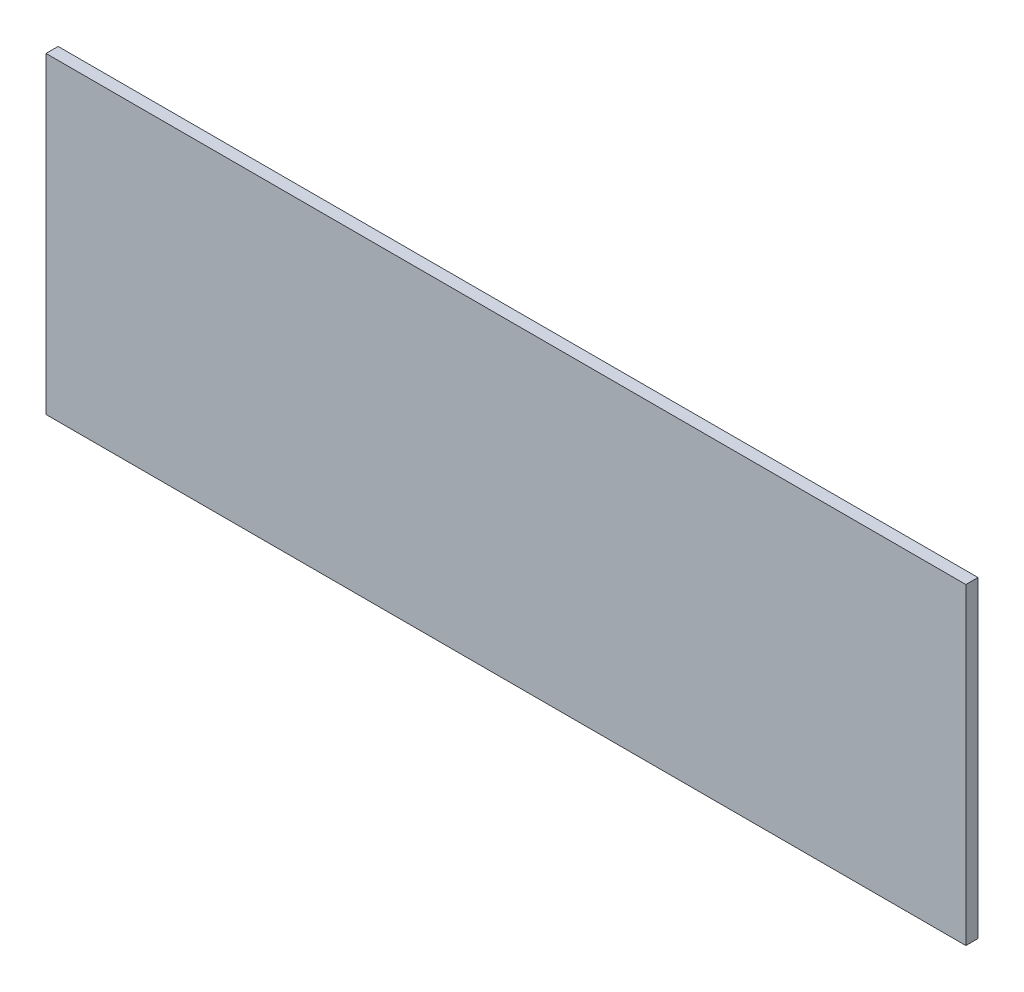
ISO-10303-21;
HEADER;
FILE_DESCRIPTION(('STEP AP214'),'2;1');
FILE_NAME('part.step','',(''),(''),'','','');
FILE_SCHEMA(('AUTOMOTIVE_DESIGN { 1 0 10303 214 1 1 1 1 }'));
ENDSEC;
DATA;
#1=APPLICATION_CONTEXT('core data for automotive mechanical design processes');
#2=APPLICATION_PROTOCOL_DEFINITION('international standard','automotive_design',2000,#1);
#3=PRODUCT_CONTEXT('',#1,'mechanical');
#4=PRODUCT('Part','Part','',(#3));
#5=PRODUCT_RELATED_PRODUCT_CATEGORY('part','',(#4));
#6=PRODUCT_DEFINITION_FORMATION('','',#4);
#7=PRODUCT_DEFINITION_CONTEXT('part definition',#1,'design');
#8=PRODUCT_DEFINITION('design','',#6,#7);
#9=PRODUCT_DEFINITION_SHAPE('','',#8);
#10=(LENGTH_UNIT() NAMED_UNIT(*) SI_UNIT(.MILLI.,.METRE.));
#11=(NAMED_UNIT(*) PLANE_ANGLE_UNIT() SI_UNIT($,.RADIAN.));
#12=(NAMED_UNIT(*) SI_UNIT($,.STERADIAN.) SOLID_ANGLE_UNIT());
#13=UNCERTAINTY_MEASURE_WITH_UNIT(LENGTH_MEASURE(1.E-05),#10,'distance_accuracy_value','');
#14=(GEOMETRIC_REPRESENTATION_CONTEXT(3) GLOBAL_UNCERTAINTY_ASSIGNED_CONTEXT((#13)) GLOBAL_UNIT_ASSIGNED_CONTEXT((#10,
#11,#12)) REPRESENTATION_CONTEXT('',''));
#15=CARTESIAN_POINT('',(0.,0.,0.));
#16=DIRECTION('',(0.,0.,1.));
#17=DIRECTION('',(1.,0.,0.));
#18=AXIS2_PLACEMENT_3D('',#15,#16,#17);
#19=CARTESIAN_POINT('',(151.5,-51.5,4.));
#20=DIRECTION('',(-1.,0.,0.));
#21=DIRECTION('',(0.,0.,1.));
#22=AXIS2_PLACEMENT_3D('',#19,#20,#21);
#23=PLANE('',#22);
#24=DIRECTION('',(0.,1.,0.));
#25=VECTOR('',#24,1.);
#26=CARTESIAN_POINT('',(151.5,-51.5,0.));
#27=LINE('',#26,#25);
#28=CARTESIAN_POINT('',(151.5,-51.5,0.));
#29=VERTEX_POINT('',#28);
#30=CARTESIAN_POINT('',(151.5,51.5,0.));
#31=VERTEX_POINT('',#30);
#32=EDGE_CURVE('E116',#29,#31,#27,.T.);
#33=ORIENTED_EDGE('',*,*,#32,.T.);
#34=DIRECTION('',(0.,0.,-1.));
#35=VECTOR('',#34,1.);
#36=CARTESIAN_POINT('',(151.5,51.5,4.));
#37=LINE('',#36,#35);
#38=CARTESIAN_POINT('',(151.5,51.5,4.));
#39=VERTEX_POINT('',#38);
#40=EDGE_CURVE('E11',#39,#31,#37,.T.);
#41=ORIENTED_EDGE('',*,*,#40,.F.);
#42=DIRECTION('',(0.,1.,0.));
#43=VECTOR('',#42,1.);
#44=CARTESIAN_POINT('',(151.5,-51.5,4.));
#45=LINE('',#44,#43);
#46=CARTESIAN_POINT('',(151.5,-51.5,4.));
#47=VERTEX_POINT('',#46);
#48=EDGE_CURVE('E99',#47,#39,#45,.T.);
#49=ORIENTED_EDGE('',*,*,#48,.F.);
#50=DIRECTION('',(0.,0.,-1.));
#51=VECTOR('',#50,1.);
#52=CARTESIAN_POINT('',(151.5,-51.5,4.));
#53=LINE('',#52,#51);
#54=EDGE_CURVE('E112',#47,#29,#53,.T.);
#55=ORIENTED_EDGE('',*,*,#54,.T.);
#56=EDGE_LOOP('',(#33,#41,#49,#55));
#57=FACE_BOUND('',#56,.T.);
#58=ADVANCED_FACE('F47',(#57),#23,.F.);
#59=CARTESIAN_POINT('',(-151.5,51.5,4.));
#60=DIRECTION('',(0.,-1.,0.));
#61=DIRECTION('',(0.,0.,-1.));
#62=AXIS2_PLACEMENT_3D('',#59,#60,#61);
#63=PLANE('',#62);
#64=DIRECTION('',(-1.,0.,0.));
#65=VECTOR('',#64,1.);
#66=CARTESIAN_POINT('',(-151.5,51.5,0.));
#67=LINE('',#66,#65);
#68=CARTESIAN_POINT('',(-151.5,51.5,0.));
#69=VERTEX_POINT('',#68);
#70=EDGE_CURVE('E104',#31,#69,#67,.T.);
#71=ORIENTED_EDGE('',*,*,#70,.T.);
#72=DIRECTION('',(0.,0.,-1.));
#73=VECTOR('',#72,1.);
#74=CARTESIAN_POINT('',(-151.5,51.5,4.));
#75=LINE('',#74,#73);
#76=CARTESIAN_POINT('',(-151.5,51.5,4.));
#77=VERTEX_POINT('',#76);
#78=EDGE_CURVE('E56',#77,#69,#75,.T.);
#79=ORIENTED_EDGE('',*,*,#78,.F.);
#80=DIRECTION('',(-1.,0.,0.));
#81=VECTOR('',#80,1.);
#82=CARTESIAN_POINT('',(-151.5,51.5,4.));
#83=LINE('',#82,#81);
#84=EDGE_CURVE('E94',#39,#77,#83,.T.);
#85=ORIENTED_EDGE('',*,*,#84,.F.);
#86=ORIENTED_EDGE('',*,*,#40,.T.);
#87=EDGE_LOOP('',(#71,#79,#85,#86));
#88=FACE_BOUND('',#87,.T.);
#89=ADVANCED_FACE('F103',(#88),#63,.F.);
#90=CARTESIAN_POINT('',(-151.5,-51.5,4.));
#91=DIRECTION('',(1.,0.,0.));
#92=DIRECTION('',(0.,0.,-1.));
#93=AXIS2_PLACEMENT_3D('',#90,#91,#92);
#94=PLANE('',#93);
#95=DIRECTION('',(0.,-1.,0.));
#96=VECTOR('',#95,1.);
#97=CARTESIAN_POINT('',(-151.5,-51.5,0.));
#98=LINE('',#97,#96);
#99=CARTESIAN_POINT('',(-151.5,-51.5,0.));
#100=VERTEX_POINT('',#99);
#101=EDGE_CURVE('E81',#69,#100,#98,.T.);
#102=ORIENTED_EDGE('',*,*,#101,.T.);
#103=DIRECTION('',(0.,0.,-1.));
#104=VECTOR('',#103,1.);
#105=CARTESIAN_POINT('',(-151.5,-51.5,4.));
#106=LINE('',#105,#104);
#107=CARTESIAN_POINT('',(-151.5,-51.5,4.));
#108=VERTEX_POINT('',#107);
#109=EDGE_CURVE('E106',#108,#100,#106,.T.);
#110=ORIENTED_EDGE('',*,*,#109,.F.);
#111=DIRECTION('',(0.,-1.,0.));
#112=VECTOR('',#111,1.);
#113=CARTESIAN_POINT('',(-151.5,-51.5,4.));
#114=LINE('',#113,#112);
#115=EDGE_CURVE('E97',#77,#108,#114,.T.);
#116=ORIENTED_EDGE('',*,*,#115,.F.);
#117=ORIENTED_EDGE('',*,*,#78,.T.);
#118=EDGE_LOOP('',(#102,#110,#116,#117));
#119=FACE_BOUND('',#118,.T.);
#120=ADVANCED_FACE('F107',(#119),#94,.F.);
#121=CARTESIAN_POINT('',(-151.5,-51.5,4.));
#122=DIRECTION('',(0.,1.,0.));
#123=DIRECTION('',(0.,0.,1.));
#124=AXIS2_PLACEMENT_3D('',#121,#122,#123);
#125=PLANE('',#124);
#126=DIRECTION('',(1.,0.,0.));
#127=VECTOR('',#126,1.);
#128=CARTESIAN_POINT('',(-151.5,-51.5,0.));
#129=LINE('',#128,#127);
#130=EDGE_CURVE('E87',#100,#29,#129,.T.);
#131=ORIENTED_EDGE('',*,*,#130,.T.);
#132=ORIENTED_EDGE('',*,*,#54,.F.);
#133=DIRECTION('',(1.,0.,0.));
#134=VECTOR('',#133,1.);
#135=CARTESIAN_POINT('',(-151.5,-51.5,4.));
#136=LINE('',#135,#134);
#137=EDGE_CURVE('E64',#108,#47,#136,.T.);
#138=ORIENTED_EDGE('',*,*,#137,.F.);
#139=ORIENTED_EDGE('',*,*,#109,.T.);
#140=EDGE_LOOP('',(#131,#132,#138,#139));
#141=FACE_BOUND('',#140,.T.);
#142=ADVANCED_FACE('F130',(#141),#125,.F.);
#143=CARTESIAN_POINT('',(0.,0.,4.));
#144=DIRECTION('',(0.,0.,-1.));
#145=DIRECTION('',(-1.,0.,0.));
#146=AXIS2_PLACEMENT_3D('',#143,#144,#145);
#147=PLANE('',#146);
#148=ORIENTED_EDGE('',*,*,#48,.T.);
#149=ORIENTED_EDGE('',*,*,#84,.T.);
#150=ORIENTED_EDGE('',*,*,#115,.T.);
#151=ORIENTED_EDGE('',*,*,#137,.T.);
#152=EDGE_LOOP('',(#148,#149,#150,#151));
#153=FACE_BOUND('',#152,.T.);
#154=ADVANCED_FACE('F95',(#153),#147,.F.);
#155=CARTESIAN_POINT('',(0.,0.,0.));
#156=DIRECTION('',(0.,0.,-1.));
#157=DIRECTION('',(-1.,0.,0.));
#158=AXIS2_PLACEMENT_3D('',#155,#156,#157);
#159=PLANE('',#158);
#160=ORIENTED_EDGE('',*,*,#32,.F.);
#161=ORIENTED_EDGE('',*,*,#130,.F.);
#162=ORIENTED_EDGE('',*,*,#101,.F.);
#163=ORIENTED_EDGE('',*,*,#70,.F.);
#164=EDGE_LOOP('',(#160,#161,#162,#163));
#165=FACE_BOUND('',#164,.T.);
#166=ADVANCED_FACE('F133',(#165),#159,.T.);
#167=CLOSED_SHELL('',(#58,#89,#120,#142,#154,#166));
#168=MANIFOLD_SOLID_BREP('B2',#167);
#169=ADVANCED_BREP_SHAPE_REPRESENTATION('',(#18,#168),#14);
#170=SHAPE_DEFINITION_REPRESENTATION(#9,#169);
ENDSEC;
END-ISO-10303-21;
